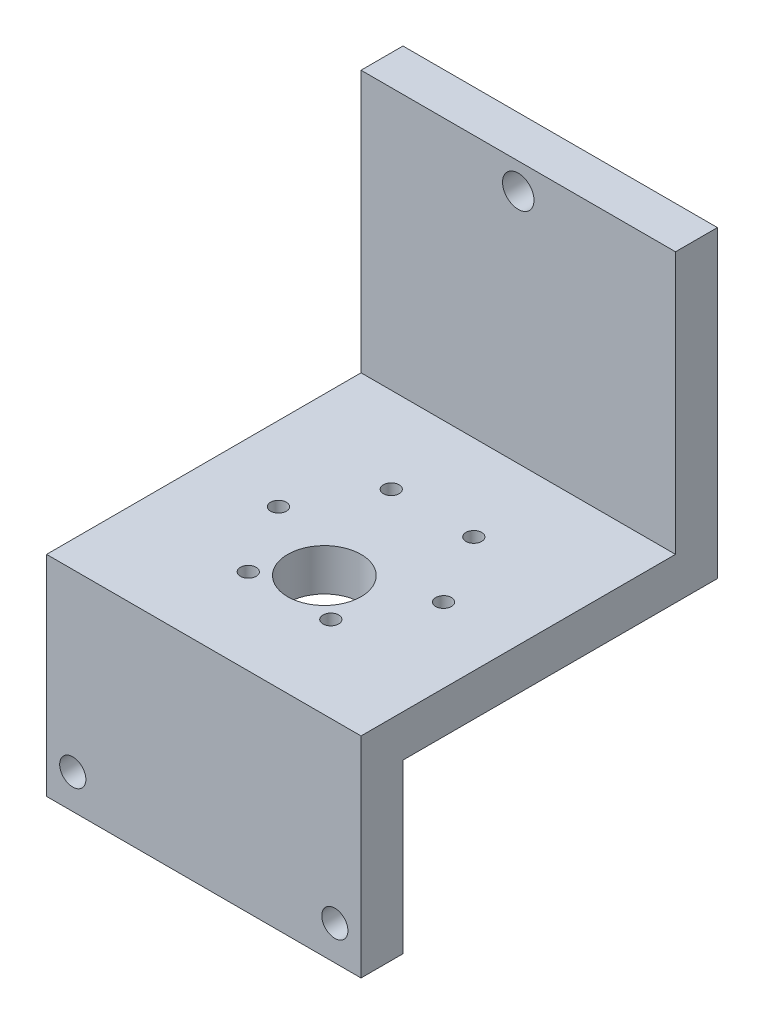
ISO-10303-21;
HEADER;
FILE_DESCRIPTION(('STEP AP214'),'2;1');
FILE_NAME('part.step','',(''),(''),'','','');
FILE_SCHEMA(('AUTOMOTIVE_DESIGN { 1 0 10303 214 1 1 1 1 }'));
ENDSEC;
DATA;
#1=APPLICATION_CONTEXT('core data for automotive mechanical design processes');
#2=APPLICATION_PROTOCOL_DEFINITION('international standard','automotive_design',2000,#1);
#3=PRODUCT_CONTEXT('',#1,'mechanical');
#4=PRODUCT('Part','Part','',(#3));
#5=PRODUCT_RELATED_PRODUCT_CATEGORY('part','',(#4));
#6=PRODUCT_DEFINITION_FORMATION('','',#4);
#7=PRODUCT_DEFINITION_CONTEXT('part definition',#1,'design');
#8=PRODUCT_DEFINITION('design','',#6,#7);
#9=PRODUCT_DEFINITION_SHAPE('','',#8);
#10=(LENGTH_UNIT() NAMED_UNIT(*) SI_UNIT(.MILLI.,.METRE.));
#11=(NAMED_UNIT(*) PLANE_ANGLE_UNIT() SI_UNIT($,.RADIAN.));
#12=(NAMED_UNIT(*) SI_UNIT($,.STERADIAN.) SOLID_ANGLE_UNIT());
#13=UNCERTAINTY_MEASURE_WITH_UNIT(LENGTH_MEASURE(1.E-05),#10,'distance_accuracy_value','');
#14=(GEOMETRIC_REPRESENTATION_CONTEXT(3) GLOBAL_UNCERTAINTY_ASSIGNED_CONTEXT((#13)) GLOBAL_UNIT_ASSIGNED_CONTEXT((#10,
#11,#12)) REPRESENTATION_CONTEXT('',''));
#15=CARTESIAN_POINT('',(0.,0.,0.));
#16=DIRECTION('',(0.,0.,1.));
#17=DIRECTION('',(1.,0.,0.));
#18=AXIS2_PLACEMENT_3D('',#15,#16,#17);
#19=CARTESIAN_POINT('',(30.,50.,-8.));
#20=DIRECTION('',(0.,-1.,0.));
#21=DIRECTION('',(0.,0.,-1.));
#22=AXIS2_PLACEMENT_3D('',#19,#20,#21);
#23=PLANE('',#22);
#24=DIRECTION('',(0.,0.,1.));
#25=VECTOR('',#24,1.);
#26=CARTESIAN_POINT('',(-30.,50.,-8.));
#27=LINE('',#26,#25);
#28=CARTESIAN_POINT('',(-30.,50.,-8.));
#29=VERTEX_POINT('',#28);
#30=CARTESIAN_POINT('',(-30.,50.,0.));
#31=VERTEX_POINT('',#30);
#32=EDGE_CURVE('E193',#29,#31,#27,.T.);
#33=ORIENTED_EDGE('',*,*,#32,.T.);
#34=DIRECTION('',(-1.,0.,0.));
#35=VECTOR('',#34,1.);
#36=CARTESIAN_POINT('',(30.,50.,0.));
#37=LINE('',#36,#35);
#38=CARTESIAN_POINT('',(30.,50.,0.));
#39=VERTEX_POINT('',#38);
#40=EDGE_CURVE('E11',#39,#31,#37,.T.);
#41=ORIENTED_EDGE('',*,*,#40,.F.);
#42=DIRECTION('',(0.,0.,1.));
#43=VECTOR('',#42,1.);
#44=CARTESIAN_POINT('',(30.,50.,-8.));
#45=LINE('',#44,#43);
#46=CARTESIAN_POINT('',(30.,50.,-8.));
#47=VERTEX_POINT('',#46);
#48=EDGE_CURVE('E185',#47,#39,#45,.T.);
#49=ORIENTED_EDGE('',*,*,#48,.F.);
#50=DIRECTION('',(-1.,0.,0.));
#51=VECTOR('',#50,1.);
#52=CARTESIAN_POINT('',(30.,50.,-8.));
#53=LINE('',#52,#51);
#54=EDGE_CURVE('E192',#47,#29,#53,.T.);
#55=ORIENTED_EDGE('',*,*,#54,.T.);
#56=EDGE_LOOP('',(#33,#41,#49,#55));
#57=FACE_BOUND('',#56,.T.);
#58=ADVANCED_FACE('F33',(#57),#23,.F.);
#59=CARTESIAN_POINT('',(30.,50.,0.));
#60=DIRECTION('',(0.,0.,-1.));
#61=DIRECTION('',(0.,1.,0.));
#62=AXIS2_PLACEMENT_3D('',#59,#60,#61);
#63=PLANE('',#62);
#64=CARTESIAN_POINT('',(0.,45.,0.));
#65=DIRECTION('',(0.,0.,1.));
#66=DIRECTION('',(1.,0.,0.));
#67=AXIS2_PLACEMENT_3D('',#64,#65,#66);
#68=CIRCLE('',#67,3.);
#69=CARTESIAN_POINT('',(3.,45.,0.));
#70=VERTEX_POINT('',#69);
#71=EDGE_CURVE('E152',#70,#70,#68,.T.);
#72=ORIENTED_EDGE('',*,*,#71,.F.);
#73=EDGE_LOOP('',(#72));
#74=FACE_BOUND('',#73,.T.);
#75=DIRECTION('',(0.,-1.,0.));
#76=VECTOR('',#75,1.);
#77=CARTESIAN_POINT('',(-30.,50.,0.));
#78=LINE('',#77,#76);
#79=CARTESIAN_POINT('',(-30.,0.,0.));
#80=VERTEX_POINT('',#79);
#81=EDGE_CURVE('E118',#31,#80,#78,.T.);
#82=ORIENTED_EDGE('',*,*,#81,.T.);
#83=DIRECTION('',(-1.,0.,0.));
#84=VECTOR('',#83,1.);
#85=CARTESIAN_POINT('',(30.,0.,0.));
#86=LINE('',#85,#84);
#87=CARTESIAN_POINT('',(30.,0.,0.));
#88=VERTEX_POINT('',#87);
#89=EDGE_CURVE('E42',#88,#80,#86,.T.);
#90=ORIENTED_EDGE('',*,*,#89,.F.);
#91=DIRECTION('',(0.,-1.,0.));
#92=VECTOR('',#91,1.);
#93=CARTESIAN_POINT('',(30.,50.,0.));
#94=LINE('',#93,#92);
#95=EDGE_CURVE('E85',#39,#88,#94,.T.);
#96=ORIENTED_EDGE('',*,*,#95,.F.);
#97=ORIENTED_EDGE('',*,*,#40,.T.);
#98=EDGE_LOOP('',(#82,#90,#96,#97));
#99=FACE_BOUND('',#98,.T.);
#100=ADVANCED_FACE('F219',(#74,#99),#63,.F.);
#101=CARTESIAN_POINT('',(30.,0.,0.));
#102=DIRECTION('',(0.,-1.,0.));
#103=DIRECTION('',(0.,0.,-1.));
#104=AXIS2_PLACEMENT_3D('',#101,#102,#103);
#105=PLANE('',#104);
#106=CARTESIAN_POINT('',(7.87499999999999,0.,16.3600998903951));
#107=DIRECTION('',(0.,1.,0.));
#108=DIRECTION('',(0.,0.,1.));
#109=AXIS2_PLACEMENT_3D('',#106,#107,#108);
#110=CIRCLE('',#109,1.5);
#111=CARTESIAN_POINT('',(7.87499999999999,0.,17.8600998903951));
#112=VERTEX_POINT('',#111);
#113=EDGE_CURVE('E157',#112,#112,#110,.T.);
#114=ORIENTED_EDGE('',*,*,#113,.F.);
#115=EDGE_LOOP('',(#114));
#116=FACE_BOUND('',#115,.T.);
#117=CARTESIAN_POINT('',(-7.87500000000001,0.,16.3600998903951));
#118=DIRECTION('',(0.,1.,0.));
#119=DIRECTION('',(0.,0.,1.));
#120=AXIS2_PLACEMENT_3D('',#117,#118,#119);
#121=CIRCLE('',#120,1.5);
#122=CARTESIAN_POINT('',(-7.87500000000001,0.,17.8600998903951));
#123=VERTEX_POINT('',#122);
#124=EDGE_CURVE('E161',#123,#123,#121,.T.);
#125=ORIENTED_EDGE('',*,*,#124,.F.);
#126=EDGE_LOOP('',(#125));
#127=FACE_BOUND('',#126,.T.);
#128=CARTESIAN_POINT('',(-15.75,0.,30.));
#129=DIRECTION('',(0.,1.,0.));
#130=DIRECTION('',(0.,0.,1.));
#131=AXIS2_PLACEMENT_3D('',#128,#129,#130);
#132=CIRCLE('',#131,1.5);
#133=CARTESIAN_POINT('',(-15.75,0.,31.5));
#134=VERTEX_POINT('',#133);
#135=EDGE_CURVE('E165',#134,#134,#132,.T.);
#136=ORIENTED_EDGE('',*,*,#135,.F.);
#137=EDGE_LOOP('',(#136));
#138=FACE_BOUND('',#137,.T.);
#139=CARTESIAN_POINT('',(-7.875,0.,43.6399001096049));
#140=DIRECTION('',(0.,1.,0.));
#141=DIRECTION('',(0.,0.,1.));
#142=AXIS2_PLACEMENT_3D('',#139,#140,#141);
#143=CIRCLE('',#142,1.5);
#144=CARTESIAN_POINT('',(-7.875,0.,45.1399001096049));
#145=VERTEX_POINT('',#144);
#146=EDGE_CURVE('E169',#145,#145,#143,.T.);
#147=ORIENTED_EDGE('',*,*,#146,.F.);
#148=EDGE_LOOP('',(#147));
#149=FACE_BOUND('',#148,.T.);
#150=CARTESIAN_POINT('',(7.875,0.,43.6399001096049));
#151=DIRECTION('',(0.,1.,0.));
#152=DIRECTION('',(0.,0.,1.));
#153=AXIS2_PLACEMENT_3D('',#150,#151,#152);
#154=CIRCLE('',#153,1.5);
#155=CARTESIAN_POINT('',(7.875,0.,45.1399001096049));
#156=VERTEX_POINT('',#155);
#157=EDGE_CURVE('E173',#156,#156,#154,.T.);
#158=ORIENTED_EDGE('',*,*,#157,.F.);
#159=EDGE_LOOP('',(#158));
#160=FACE_BOUND('',#159,.T.);
#161=CARTESIAN_POINT('',(15.75,0.,30.));
#162=DIRECTION('',(0.,1.,0.));
#163=DIRECTION('',(0.,0.,1.));
#164=AXIS2_PLACEMENT_3D('',#161,#162,#163);
#165=CIRCLE('',#164,1.5);
#166=CARTESIAN_POINT('',(15.75,0.,31.5));
#167=VERTEX_POINT('',#166);
#168=EDGE_CURVE('E177',#167,#167,#165,.T.);
#169=ORIENTED_EDGE('',*,*,#168,.F.);
#170=EDGE_LOOP('',(#169));
#171=FACE_BOUND('',#170,.T.);
#172=CARTESIAN_POINT('',(0.,0.,37.));
#173=DIRECTION('',(0.,1.,0.));
#174=DIRECTION('',(0.,0.,1.));
#175=AXIS2_PLACEMENT_3D('',#172,#173,#174);
#176=CIRCLE('',#175,7.);
#177=CARTESIAN_POINT('',(0.,0.,44.));
#178=VERTEX_POINT('',#177);
#179=EDGE_CURVE('E181',#178,#178,#176,.T.);
#180=ORIENTED_EDGE('',*,*,#179,.F.);
#181=EDGE_LOOP('',(#180));
#182=FACE_BOUND('',#181,.T.);
#183=DIRECTION('',(0.,0.,1.));
#184=VECTOR('',#183,1.);
#185=CARTESIAN_POINT('',(-30.,0.,0.));
#186=LINE('',#185,#184);
#187=CARTESIAN_POINT('',(-30.,0.,60.));
#188=VERTEX_POINT('',#187);
#189=EDGE_CURVE('E110',#80,#188,#186,.T.);
#190=ORIENTED_EDGE('',*,*,#189,.T.);
#191=DIRECTION('',(1.,0.,0.));
#192=VECTOR('',#191,1.);
#193=CARTESIAN_POINT('',(-30.,0.,60.));
#194=LINE('',#193,#192);
#195=CARTESIAN_POINT('',(30.,0.,60.));
#196=VERTEX_POINT('',#195);
#197=EDGE_CURVE('E114',#188,#196,#194,.T.);
#198=ORIENTED_EDGE('',*,*,#197,.T.);
#199=DIRECTION('',(0.,0.,1.));
#200=VECTOR('',#199,1.);
#201=CARTESIAN_POINT('',(30.,0.,0.));
#202=LINE('',#201,#200);
#203=EDGE_CURVE('E188',#88,#196,#202,.T.);
#204=ORIENTED_EDGE('',*,*,#203,.F.);
#205=ORIENTED_EDGE('',*,*,#89,.T.);
#206=EDGE_LOOP('',(#190,#198,#204,#205));
#207=FACE_BOUND('',#206,.T.);
#208=ADVANCED_FACE('F112',(#116,#127,#138,#149,#160,#171,#182,#207),#105,.F.);
#209=CARTESIAN_POINT('',(30.,-8.00000000000001,52.));
#210=DIRECTION('',(0.,1.,0.));
#211=DIRECTION('',(0.,0.,1.));
#212=AXIS2_PLACEMENT_3D('',#209,#210,#211);
#213=PLANE('',#212);
#214=CARTESIAN_POINT('',(7.87499999999999,-8.00000000000001,16.3600998903951));
#215=DIRECTION('',(0.,1.,0.));
#216=DIRECTION('',(0.,0.,1.));
#217=AXIS2_PLACEMENT_3D('',#214,#215,#216);
#218=CIRCLE('',#217,1.5);
#219=CARTESIAN_POINT('',(7.87499999999999,-8.00000000000001,17.8600998903951));
#220=VERTEX_POINT('',#219);
#221=EDGE_CURVE('E160',#220,#220,#218,.T.);
#222=ORIENTED_EDGE('',*,*,#221,.T.);
#223=EDGE_LOOP('',(#222));
#224=FACE_BOUND('',#223,.T.);
#225=CARTESIAN_POINT('',(-7.87500000000001,-8.00000000000001,16.3600998903951));
#226=DIRECTION('',(0.,1.,0.));
#227=DIRECTION('',(0.,0.,1.));
#228=AXIS2_PLACEMENT_3D('',#225,#226,#227);
#229=CIRCLE('',#228,1.5);
#230=CARTESIAN_POINT('',(-7.87500000000001,-8.00000000000001,17.8600998903951));
#231=VERTEX_POINT('',#230);
#232=EDGE_CURVE('E164',#231,#231,#229,.T.);
#233=ORIENTED_EDGE('',*,*,#232,.T.);
#234=EDGE_LOOP('',(#233));
#235=FACE_BOUND('',#234,.T.);
#236=CARTESIAN_POINT('',(-15.75,-8.00000000000001,30.));
#237=DIRECTION('',(0.,1.,0.));
#238=DIRECTION('',(0.,0.,1.));
#239=AXIS2_PLACEMENT_3D('',#236,#237,#238);
#240=CIRCLE('',#239,1.5);
#241=CARTESIAN_POINT('',(-15.75,-8.00000000000001,31.5));
#242=VERTEX_POINT('',#241);
#243=EDGE_CURVE('E168',#242,#242,#240,.T.);
#244=ORIENTED_EDGE('',*,*,#243,.T.);
#245=EDGE_LOOP('',(#244));
#246=FACE_BOUND('',#245,.T.);
#247=CARTESIAN_POINT('',(-7.875,-8.00000000000001,43.6399001096049));
#248=DIRECTION('',(0.,1.,0.));
#249=DIRECTION('',(0.,0.,1.));
#250=AXIS2_PLACEMENT_3D('',#247,#248,#249);
#251=CIRCLE('',#250,1.5);
#252=CARTESIAN_POINT('',(-7.875,-8.00000000000001,45.1399001096049));
#253=VERTEX_POINT('',#252);
#254=EDGE_CURVE('E172',#253,#253,#251,.T.);
#255=ORIENTED_EDGE('',*,*,#254,.T.);
#256=EDGE_LOOP('',(#255));
#257=FACE_BOUND('',#256,.T.);
#258=CARTESIAN_POINT('',(7.875,-8.00000000000001,43.6399001096049));
#259=DIRECTION('',(0.,1.,0.));
#260=DIRECTION('',(0.,0.,1.));
#261=AXIS2_PLACEMENT_3D('',#258,#259,#260);
#262=CIRCLE('',#261,1.5);
#263=CARTESIAN_POINT('',(7.875,-8.00000000000001,45.1399001096049));
#264=VERTEX_POINT('',#263);
#265=EDGE_CURVE('E176',#264,#264,#262,.T.);
#266=ORIENTED_EDGE('',*,*,#265,.T.);
#267=EDGE_LOOP('',(#266));
#268=FACE_BOUND('',#267,.T.);
#269=CARTESIAN_POINT('',(15.75,-8.00000000000001,30.));
#270=DIRECTION('',(0.,1.,0.));
#271=DIRECTION('',(0.,0.,1.));
#272=AXIS2_PLACEMENT_3D('',#269,#270,#271);
#273=CIRCLE('',#272,1.5);
#274=CARTESIAN_POINT('',(15.75,-8.00000000000001,31.5));
#275=VERTEX_POINT('',#274);
#276=EDGE_CURVE('E180',#275,#275,#273,.T.);
#277=ORIENTED_EDGE('',*,*,#276,.T.);
#278=EDGE_LOOP('',(#277));
#279=FACE_BOUND('',#278,.T.);
#280=CARTESIAN_POINT('',(0.,-8.00000000000001,37.));
#281=DIRECTION('',(0.,1.,0.));
#282=DIRECTION('',(0.,0.,1.));
#283=AXIS2_PLACEMENT_3D('',#280,#281,#282);
#284=CIRCLE('',#283,7.);
#285=CARTESIAN_POINT('',(0.,-8.00000000000001,44.));
#286=VERTEX_POINT('',#285);
#287=EDGE_CURVE('E184',#286,#286,#284,.T.);
#288=ORIENTED_EDGE('',*,*,#287,.T.);
#289=EDGE_LOOP('',(#288));
#290=FACE_BOUND('',#289,.T.);
#291=DIRECTION('',(0.,0.,-1.));
#292=VECTOR('',#291,1.);
#293=CARTESIAN_POINT('',(-30.,-8.00000000000001,52.));
#294=LINE('',#293,#292);
#295=CARTESIAN_POINT('',(-30.,-8.00000000000001,52.));
#296=VERTEX_POINT('',#295);
#297=CARTESIAN_POINT('',(-30.,-8.00000000000001,-8.00000000000001));
#298=VERTEX_POINT('',#297);
#299=EDGE_CURVE('E72',#296,#298,#294,.T.);
#300=ORIENTED_EDGE('',*,*,#299,.T.);
#301=DIRECTION('',(-1.,0.,0.));
#302=VECTOR('',#301,1.);
#303=CARTESIAN_POINT('',(30.,-8.00000000000001,-8.00000000000001));
#304=LINE('',#303,#302);
#305=CARTESIAN_POINT('',(30.,-8.00000000000001,-8.00000000000001));
#306=VERTEX_POINT('',#305);
#307=EDGE_CURVE('E199',#306,#298,#304,.T.);
#308=ORIENTED_EDGE('',*,*,#307,.F.);
#309=DIRECTION('',(0.,0.,-1.));
#310=VECTOR('',#309,1.);
#311=CARTESIAN_POINT('',(30.,-8.00000000000001,52.));
#312=LINE('',#311,#310);
#313=CARTESIAN_POINT('',(30.,-8.00000000000001,52.));
#314=VERTEX_POINT('',#313);
#315=EDGE_CURVE('E190',#314,#306,#312,.T.);
#316=ORIENTED_EDGE('',*,*,#315,.F.);
#317=DIRECTION('',(-1.,0.,0.));
#318=VECTOR('',#317,1.);
#319=CARTESIAN_POINT('',(30.,-8.00000000000001,52.));
#320=LINE('',#319,#318);
#321=EDGE_CURVE('E201',#314,#296,#320,.T.);
#322=ORIENTED_EDGE('',*,*,#321,.T.);
#323=EDGE_LOOP('',(#300,#308,#316,#322));
#324=FACE_BOUND('',#323,.T.);
#325=ADVANCED_FACE('F214',(#224,#235,#246,#257,#268,#279,#290,#324),#213,.F.);
#326=CARTESIAN_POINT('',(30.,-8.00000000000001,-8.00000000000001));
#327=DIRECTION('',(0.,0.,1.));
#328=DIRECTION('',(0.,-1.,0.));
#329=AXIS2_PLACEMENT_3D('',#326,#327,#328);
#330=PLANE('',#329);
#331=CARTESIAN_POINT('',(0.,45.,-8.));
#332=DIRECTION('',(0.,0.,1.));
#333=DIRECTION('',(0.,-1.,0.));
#334=AXIS2_PLACEMENT_3D('',#331,#332,#333);
#335=CIRCLE('',#334,3.);
#336=CARTESIAN_POINT('',(0.,42.,-8.));
#337=VERTEX_POINT('',#336);
#338=EDGE_CURVE('E155',#337,#337,#335,.T.);
#339=ORIENTED_EDGE('',*,*,#338,.T.);
#340=EDGE_LOOP('',(#339));
#341=FACE_BOUND('',#340,.T.);
#342=DIRECTION('',(0.,1.,0.));
#343=VECTOR('',#342,1.);
#344=CARTESIAN_POINT('',(-30.,-8.00000000000001,-8.00000000000001));
#345=LINE('',#344,#343);
#346=EDGE_CURVE('E78',#298,#29,#345,.T.);
#347=ORIENTED_EDGE('',*,*,#346,.T.);
#348=ORIENTED_EDGE('',*,*,#54,.F.);
#349=DIRECTION('',(0.,1.,0.));
#350=VECTOR('',#349,1.);
#351=CARTESIAN_POINT('',(30.,-8.00000000000001,-8.00000000000001));
#352=LINE('',#351,#350);
#353=EDGE_CURVE('E51',#306,#47,#352,.T.);
#354=ORIENTED_EDGE('',*,*,#353,.F.);
#355=ORIENTED_EDGE('',*,*,#307,.T.);
#356=EDGE_LOOP('',(#347,#348,#354,#355));
#357=FACE_BOUND('',#356,.T.);
#358=ADVANCED_FACE('F215',(#341,#357),#330,.F.);
#359=CARTESIAN_POINT('',(30.,0.,0.));
#360=DIRECTION('',(1.,0.,0.));
#361=DIRECTION('',(0.,0.,-1.));
#362=AXIS2_PLACEMENT_3D('',#359,#360,#361);
#363=PLANE('',#362);
#364=ORIENTED_EDGE('',*,*,#48,.T.);
#365=ORIENTED_EDGE('',*,*,#95,.T.);
#366=ORIENTED_EDGE('',*,*,#203,.T.);
#367=DIRECTION('',(0.,-1.,0.));
#368=VECTOR('',#367,1.);
#369=CARTESIAN_POINT('',(30.,0.,60.));
#370=LINE('',#369,#368);
#371=CARTESIAN_POINT('',(30.,-40.,60.));
#372=VERTEX_POINT('',#371);
#373=EDGE_CURVE('E126',#196,#372,#370,.T.);
#374=ORIENTED_EDGE('',*,*,#373,.T.);
#375=DIRECTION('',(0.,0.,-1.));
#376=VECTOR('',#375,1.);
#377=CARTESIAN_POINT('',(30.,-40.,52.));
#378=LINE('',#377,#376);
#379=CARTESIAN_POINT('',(30.,-40.,52.));
#380=VERTEX_POINT('',#379);
#381=EDGE_CURVE('E137',#372,#380,#378,.T.);
#382=ORIENTED_EDGE('',*,*,#381,.T.);
#383=DIRECTION('',(0.,1.,0.));
#384=VECTOR('',#383,1.);
#385=CARTESIAN_POINT('',(30.,0.,52.));
#386=LINE('',#385,#384);
#387=EDGE_CURVE('E147',#380,#314,#386,.T.);
#388=ORIENTED_EDGE('',*,*,#387,.T.);
#389=ORIENTED_EDGE('',*,*,#315,.T.);
#390=ORIENTED_EDGE('',*,*,#353,.T.);
#391=EDGE_LOOP('',(#364,#365,#366,#374,#382,#388,#389,#390));
#392=FACE_BOUND('',#391,.T.);
#393=ADVANCED_FACE('F211',(#392),#363,.T.);
#394=CARTESIAN_POINT('',(-30.,0.,0.));
#395=DIRECTION('',(1.,0.,0.));
#396=DIRECTION('',(0.,0.,-1.));
#397=AXIS2_PLACEMENT_3D('',#394,#395,#396);
#398=PLANE('',#397);
#399=ORIENTED_EDGE('',*,*,#32,.F.);
#400=ORIENTED_EDGE('',*,*,#346,.F.);
#401=ORIENTED_EDGE('',*,*,#299,.F.);
#402=DIRECTION('',(0.,1.,0.));
#403=VECTOR('',#402,1.);
#404=CARTESIAN_POINT('',(-30.,0.,52.));
#405=LINE('',#404,#403);
#406=CARTESIAN_POINT('',(-30.,-40.,52.));
#407=VERTEX_POINT('',#406);
#408=EDGE_CURVE('E134',#407,#296,#405,.T.);
#409=ORIENTED_EDGE('',*,*,#408,.F.);
#410=DIRECTION('',(0.,0.,-1.));
#411=VECTOR('',#410,1.);
#412=CARTESIAN_POINT('',(-30.,-40.,52.));
#413=LINE('',#412,#411);
#414=CARTESIAN_POINT('',(-30.,-40.,60.));
#415=VERTEX_POINT('',#414);
#416=EDGE_CURVE('E128',#415,#407,#413,.T.);
#417=ORIENTED_EDGE('',*,*,#416,.F.);
#418=DIRECTION('',(0.,-1.,0.));
#419=VECTOR('',#418,1.);
#420=CARTESIAN_POINT('',(-30.,0.,60.));
#421=LINE('',#420,#419);
#422=EDGE_CURVE('E123',#188,#415,#421,.T.);
#423=ORIENTED_EDGE('',*,*,#422,.F.);
#424=ORIENTED_EDGE('',*,*,#189,.F.);
#425=ORIENTED_EDGE('',*,*,#81,.F.);
#426=EDGE_LOOP('',(#399,#400,#401,#409,#417,#423,#424,#425));
#427=FACE_BOUND('',#426,.T.);
#428=ADVANCED_FACE('F131',(#427),#398,.F.);
#429=CARTESIAN_POINT('',(0.,-55.,37.));
#430=DIRECTION('',(0.,1.,0.));
#431=DIRECTION('',(0.,0.,1.));
#432=AXIS2_PLACEMENT_3D('',#429,#430,#431);
#433=CYLINDRICAL_SURFACE('',#432,7.);
#434=ORIENTED_EDGE('',*,*,#179,.T.);
#435=EDGE_LOOP('',(#434));
#436=FACE_BOUND('',#435,.T.);
#437=ORIENTED_EDGE('',*,*,#287,.F.);
#438=EDGE_LOOP('',(#437));
#439=FACE_BOUND('',#438,.T.);
#440=ADVANCED_FACE('F263',(#436,#439),#433,.F.);
#441=CARTESIAN_POINT('',(15.75,-55.,30.));
#442=DIRECTION('',(0.,1.,0.));
#443=DIRECTION('',(0.,0.,1.));
#444=AXIS2_PLACEMENT_3D('',#441,#442,#443);
#445=CYLINDRICAL_SURFACE('',#444,1.5);
#446=ORIENTED_EDGE('',*,*,#168,.T.);
#447=EDGE_LOOP('',(#446));
#448=FACE_BOUND('',#447,.T.);
#449=ORIENTED_EDGE('',*,*,#276,.F.);
#450=EDGE_LOOP('',(#449));
#451=FACE_BOUND('',#450,.T.);
#452=ADVANCED_FACE('F268',(#448,#451),#445,.F.);
#453=CARTESIAN_POINT('',(7.875,-55.,43.6399001096049));
#454=DIRECTION('',(0.,1.,0.));
#455=DIRECTION('',(0.,0.,1.));
#456=AXIS2_PLACEMENT_3D('',#453,#454,#455);
#457=CYLINDRICAL_SURFACE('',#456,1.5);
#458=ORIENTED_EDGE('',*,*,#157,.T.);
#459=EDGE_LOOP('',(#458));
#460=FACE_BOUND('',#459,.T.);
#461=ORIENTED_EDGE('',*,*,#265,.F.);
#462=EDGE_LOOP('',(#461));
#463=FACE_BOUND('',#462,.T.);
#464=ADVANCED_FACE('F272',(#460,#463),#457,.F.);
#465=CARTESIAN_POINT('',(-7.875,-55.,43.6399001096049));
#466=DIRECTION('',(0.,1.,0.));
#467=DIRECTION('',(0.,0.,1.));
#468=AXIS2_PLACEMENT_3D('',#465,#466,#467);
#469=CYLINDRICAL_SURFACE('',#468,1.5);
#470=ORIENTED_EDGE('',*,*,#146,.T.);
#471=EDGE_LOOP('',(#470));
#472=FACE_BOUND('',#471,.T.);
#473=ORIENTED_EDGE('',*,*,#254,.F.);
#474=EDGE_LOOP('',(#473));
#475=FACE_BOUND('',#474,.T.);
#476=ADVANCED_FACE('F276',(#472,#475),#469,.F.);
#477=CARTESIAN_POINT('',(-15.75,-55.,30.));
#478=DIRECTION('',(0.,1.,0.));
#479=DIRECTION('',(0.,0.,1.));
#480=AXIS2_PLACEMENT_3D('',#477,#478,#479);
#481=CYLINDRICAL_SURFACE('',#480,1.5);
#482=ORIENTED_EDGE('',*,*,#135,.T.);
#483=EDGE_LOOP('',(#482));
#484=FACE_BOUND('',#483,.T.);
#485=ORIENTED_EDGE('',*,*,#243,.F.);
#486=EDGE_LOOP('',(#485));
#487=FACE_BOUND('',#486,.T.);
#488=ADVANCED_FACE('F280',(#484,#487),#481,.F.);
#489=CARTESIAN_POINT('',(-7.87500000000001,-55.,16.3600998903951));
#490=DIRECTION('',(0.,1.,0.));
#491=DIRECTION('',(0.,0.,1.));
#492=AXIS2_PLACEMENT_3D('',#489,#490,#491);
#493=CYLINDRICAL_SURFACE('',#492,1.5);
#494=ORIENTED_EDGE('',*,*,#124,.T.);
#495=EDGE_LOOP('',(#494));
#496=FACE_BOUND('',#495,.T.);
#497=ORIENTED_EDGE('',*,*,#232,.F.);
#498=EDGE_LOOP('',(#497));
#499=FACE_BOUND('',#498,.T.);
#500=ADVANCED_FACE('F284',(#496,#499),#493,.F.);
#501=CARTESIAN_POINT('',(7.87499999999999,-55.,16.3600998903951));
#502=DIRECTION('',(0.,1.,0.));
#503=DIRECTION('',(0.,0.,1.));
#504=AXIS2_PLACEMENT_3D('',#501,#502,#503);
#505=CYLINDRICAL_SURFACE('',#504,1.5);
#506=ORIENTED_EDGE('',*,*,#113,.T.);
#507=EDGE_LOOP('',(#506));
#508=FACE_BOUND('',#507,.T.);
#509=ORIENTED_EDGE('',*,*,#221,.F.);
#510=EDGE_LOOP('',(#509));
#511=FACE_BOUND('',#510,.T.);
#512=ADVANCED_FACE('F237',(#508,#511),#505,.F.);
#513=CARTESIAN_POINT('',(0.,45.,-55.));
#514=DIRECTION('',(0.,0.,1.));
#515=DIRECTION('',(1.,0.,0.));
#516=AXIS2_PLACEMENT_3D('',#513,#514,#515);
#517=CYLINDRICAL_SURFACE('',#516,3.);
#518=ORIENTED_EDGE('',*,*,#71,.T.);
#519=EDGE_LOOP('',(#518));
#520=FACE_BOUND('',#519,.T.);
#521=ORIENTED_EDGE('',*,*,#338,.F.);
#522=EDGE_LOOP('',(#521));
#523=FACE_BOUND('',#522,.T.);
#524=ADVANCED_FACE('F227',(#520,#523),#517,.F.);
#525=CARTESIAN_POINT('',(-30.,0.,52.));
#526=DIRECTION('',(0.,0.,-1.));
#527=DIRECTION('',(0.,1.,0.));
#528=AXIS2_PLACEMENT_3D('',#525,#526,#527);
#529=PLANE('',#528);
#530=CARTESIAN_POINT('',(-25.,-33.4500000000001,52.));
#531=DIRECTION('',(0.,0.,-1.));
#532=DIRECTION('',(0.,1.,0.));
#533=AXIS2_PLACEMENT_3D('',#530,#531,#532);
#534=CIRCLE('',#533,2.5);
#535=CARTESIAN_POINT('',(-25.,-30.9500000000001,52.));
#536=VERTEX_POINT('',#535);
#537=EDGE_CURVE('E387',#536,#536,#534,.T.);
#538=ORIENTED_EDGE('',*,*,#537,.F.);
#539=EDGE_LOOP('',(#538));
#540=FACE_BOUND('',#539,.T.);
#541=CARTESIAN_POINT('',(25.,-33.4500000000001,52.));
#542=DIRECTION('',(0.,0.,-1.));
#543=DIRECTION('',(0.,1.,0.));
#544=AXIS2_PLACEMENT_3D('',#541,#542,#543);
#545=CIRCLE('',#544,2.50000000000001);
#546=CARTESIAN_POINT('',(25.,-30.95,52.));
#547=VERTEX_POINT('',#546);
#548=EDGE_CURVE('E149',#547,#547,#545,.T.);
#549=ORIENTED_EDGE('',*,*,#548,.F.);
#550=EDGE_LOOP('',(#549));
#551=FACE_BOUND('',#550,.T.);
#552=ORIENTED_EDGE('',*,*,#321,.F.);
#553=ORIENTED_EDGE('',*,*,#387,.F.);
#554=DIRECTION('',(1.,0.,0.));
#555=VECTOR('',#554,1.);
#556=CARTESIAN_POINT('',(-30.,-40.,52.));
#557=LINE('',#556,#555);
#558=EDGE_CURVE('E156',#407,#380,#557,.T.);
#559=ORIENTED_EDGE('',*,*,#558,.F.);
#560=ORIENTED_EDGE('',*,*,#408,.T.);
#561=EDGE_LOOP('',(#552,#553,#559,#560));
#562=FACE_BOUND('',#561,.T.);
#563=ADVANCED_FACE('F225',(#540,#551,#562),#529,.T.);
#564=CARTESIAN_POINT('',(-30.,-40.,52.));
#565=DIRECTION('',(0.,-1.,0.));
#566=DIRECTION('',(0.,0.,-1.));
#567=AXIS2_PLACEMENT_3D('',#564,#565,#566);
#568=PLANE('',#567);
#569=ORIENTED_EDGE('',*,*,#381,.F.);
#570=DIRECTION('',(1.,0.,0.));
#571=VECTOR('',#570,1.);
#572=CARTESIAN_POINT('',(-30.,-40.,60.));
#573=LINE('',#572,#571);
#574=EDGE_CURVE('E127',#415,#372,#573,.T.);
#575=ORIENTED_EDGE('',*,*,#574,.F.);
#576=ORIENTED_EDGE('',*,*,#416,.T.);
#577=ORIENTED_EDGE('',*,*,#558,.T.);
#578=EDGE_LOOP('',(#569,#575,#576,#577));
#579=FACE_BOUND('',#578,.T.);
#580=ADVANCED_FACE('F223',(#579),#568,.T.);
#581=CARTESIAN_POINT('',(-30.,0.,60.));
#582=DIRECTION('',(0.,0.,1.));
#583=DIRECTION('',(0.,-1.,0.));
#584=AXIS2_PLACEMENT_3D('',#581,#582,#583);
#585=PLANE('',#584);
#586=CARTESIAN_POINT('',(-25.,-33.4500000000001,60.));
#587=DIRECTION('',(0.,0.,1.));
#588=DIRECTION('',(1.,0.,0.));
#589=AXIS2_PLACEMENT_3D('',#586,#587,#588);
#590=CIRCLE('',#589,2.5);
#591=CARTESIAN_POINT('',(-22.5,-33.4500000000001,60.));
#592=VERTEX_POINT('',#591);
#593=EDGE_CURVE('E390',#592,#592,#590,.T.);
#594=ORIENTED_EDGE('',*,*,#593,.F.);
#595=EDGE_LOOP('',(#594));
#596=FACE_BOUND('',#595,.T.);
#597=CARTESIAN_POINT('',(25.,-33.4500000000001,60.));
#598=DIRECTION('',(0.,0.,1.));
#599=DIRECTION('',(1.,0.,0.));
#600=AXIS2_PLACEMENT_3D('',#597,#598,#599);
#601=CIRCLE('',#600,2.50000000000001);
#602=CARTESIAN_POINT('',(27.5,-33.4500000000001,60.));
#603=VERTEX_POINT('',#602);
#604=EDGE_CURVE('E392',#603,#603,#601,.T.);
#605=ORIENTED_EDGE('',*,*,#604,.F.);
#606=EDGE_LOOP('',(#605));
#607=FACE_BOUND('',#606,.T.);
#608=ORIENTED_EDGE('',*,*,#373,.F.);
#609=ORIENTED_EDGE('',*,*,#197,.F.);
#610=ORIENTED_EDGE('',*,*,#422,.T.);
#611=ORIENTED_EDGE('',*,*,#574,.T.);
#612=EDGE_LOOP('',(#608,#609,#610,#611));
#613=FACE_BOUND('',#612,.T.);
#614=ADVANCED_FACE('F122',(#596,#607,#613),#585,.T.);
#615=CARTESIAN_POINT('',(25.,-33.4500000000001,50.));
#616=DIRECTION('',(0.,0.,1.));
#617=DIRECTION('',(1.,0.,0.));
#618=AXIS2_PLACEMENT_3D('',#615,#616,#617);
#619=CYLINDRICAL_SURFACE('',#618,2.50000000000001);
#620=ORIENTED_EDGE('',*,*,#548,.T.);
#621=EDGE_LOOP('',(#620));
#622=FACE_BOUND('',#621,.T.);
#623=ORIENTED_EDGE('',*,*,#604,.T.);
#624=EDGE_LOOP('',(#623));
#625=FACE_BOUND('',#624,.T.);
#626=ADVANCED_FACE('F362',(#622,#625),#619,.F.);
#627=CARTESIAN_POINT('',(-25.,-33.4500000000001,50.));
#628=DIRECTION('',(0.,0.,1.));
#629=DIRECTION('',(1.,0.,0.));
#630=AXIS2_PLACEMENT_3D('',#627,#628,#629);
#631=CYLINDRICAL_SURFACE('',#630,2.5);
#632=ORIENTED_EDGE('',*,*,#537,.T.);
#633=EDGE_LOOP('',(#632));
#634=FACE_BOUND('',#633,.T.);
#635=ORIENTED_EDGE('',*,*,#593,.T.);
#636=EDGE_LOOP('',(#635));
#637=FACE_BOUND('',#636,.T.);
#638=ADVANCED_FACE('F371',(#634,#637),#631,.F.);
#639=CLOSED_SHELL('',(#58,#100,#208,#325,#358,#393,#428,#440,#452,#464,#476,#488,#500,#512,#524,
#563,#580,#614,#626,#638));
#640=MANIFOLD_SOLID_BREP('B2',#639);
#641=ADVANCED_BREP_SHAPE_REPRESENTATION('',(#18,#640),#14);
#642=SHAPE_DEFINITION_REPRESENTATION(#9,#641);
ENDSEC;
END-ISO-10303-21;
